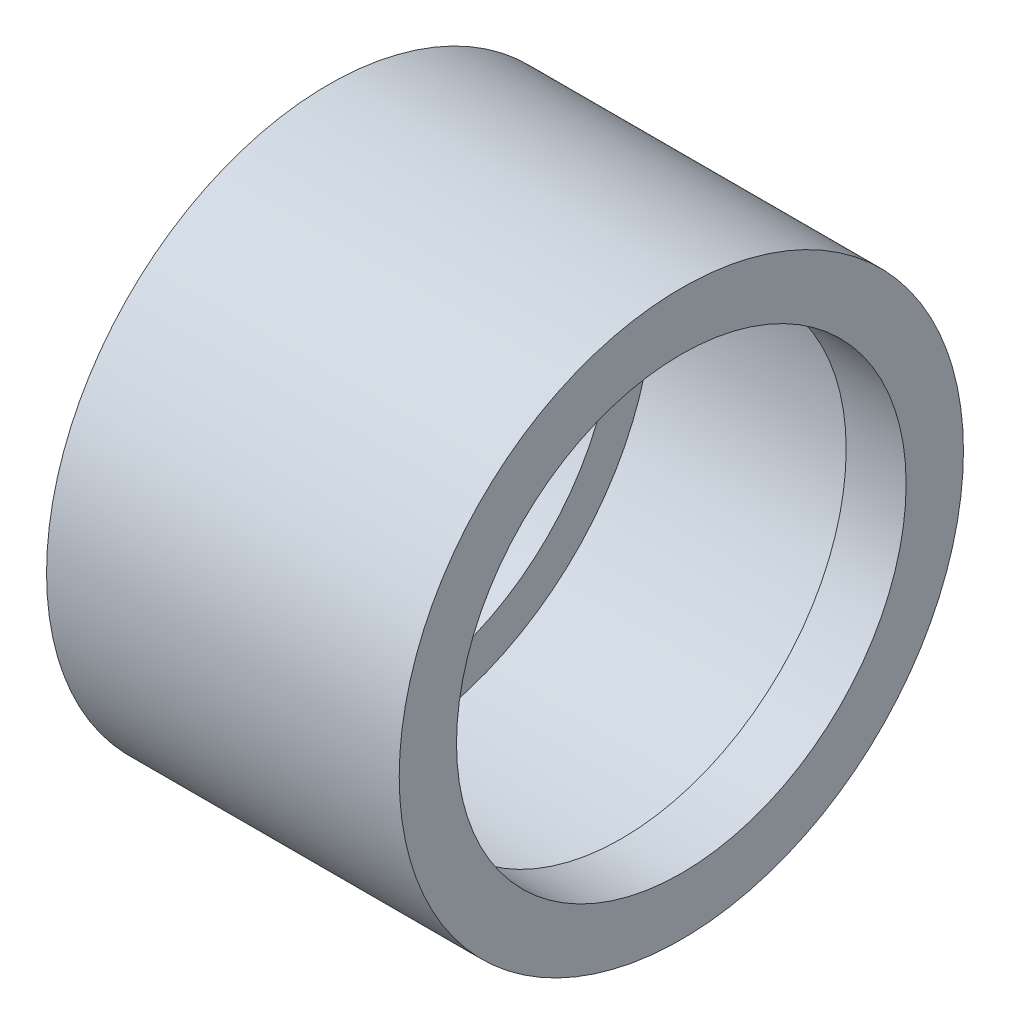
ISO-10303-21;
HEADER;
FILE_DESCRIPTION(('STEP AP214'),'2;1');
FILE_NAME('part.step','',(''),(''),'','','');
FILE_SCHEMA(('AUTOMOTIVE_DESIGN { 1 0 10303 214 1 1 1 1 }'));
ENDSEC;
DATA;
#1=APPLICATION_CONTEXT('core data for automotive mechanical design processes');
#2=APPLICATION_PROTOCOL_DEFINITION('international standard','automotive_design',2000,#1);
#3=PRODUCT_CONTEXT('',#1,'mechanical');
#4=PRODUCT('Part','Part','',(#3));
#5=PRODUCT_RELATED_PRODUCT_CATEGORY('part','',(#4));
#6=PRODUCT_DEFINITION_FORMATION('','',#4);
#7=PRODUCT_DEFINITION_CONTEXT('part definition',#1,'design');
#8=PRODUCT_DEFINITION('design','',#6,#7);
#9=PRODUCT_DEFINITION_SHAPE('','',#8);
#10=(LENGTH_UNIT() NAMED_UNIT(*) SI_UNIT(.MILLI.,.METRE.));
#11=(NAMED_UNIT(*) PLANE_ANGLE_UNIT() SI_UNIT($,.RADIAN.));
#12=(NAMED_UNIT(*) SI_UNIT($,.STERADIAN.) SOLID_ANGLE_UNIT());
#13=UNCERTAINTY_MEASURE_WITH_UNIT(LENGTH_MEASURE(1.E-05),#10,'distance_accuracy_value','');
#14=(GEOMETRIC_REPRESENTATION_CONTEXT(3) GLOBAL_UNCERTAINTY_ASSIGNED_CONTEXT((#13)) GLOBAL_UNIT_ASSIGNED_CONTEXT((#10,
#11,#12)) REPRESENTATION_CONTEXT('',''));
#15=CARTESIAN_POINT('',(0.,0.,0.));
#16=DIRECTION('',(0.,0.,1.));
#17=DIRECTION('',(1.,0.,0.));
#18=AXIS2_PLACEMENT_3D('',#15,#16,#17);
#19=CARTESIAN_POINT('',(0.,-8.21859166127047,-8.));
#20=DIRECTION('',(-1.,0.,0.));
#21=DIRECTION('',(0.,0.,1.));
#22=AXIS2_PLACEMENT_3D('',#19,#20,#21);
#23=PLANE('',#22);
#24=CARTESIAN_POINT('',(0.,0.,0.));
#25=DIRECTION('',(-1.,0.,0.));
#26=DIRECTION('',(0.,0.,-1.));
#27=AXIS2_PLACEMENT_3D('',#24,#25,#26);
#28=CIRCLE('',#27,8.);
#29=CARTESIAN_POINT('',(0.,0.,-8.));
#30=VERTEX_POINT('',#29);
#31=EDGE_CURVE('E44',#30,#30,#28,.F.);
#32=ORIENTED_EDGE('',*,*,#31,.F.);
#33=EDGE_LOOP('',(#32));
#34=FACE_BOUND('',#33,.T.);
#35=CARTESIAN_POINT('',(0.,0.,0.));
#36=DIRECTION('',(1.,0.,0.));
#37=DIRECTION('',(0.,0.,1.));
#38=AXIS2_PLACEMENT_3D('',#35,#36,#37);
#39=CIRCLE('',#38,6.375);
#40=CARTESIAN_POINT('',(0.,0.,6.375));
#41=VERTEX_POINT('',#40);
#42=EDGE_CURVE('E41',#41,#41,#39,.T.);
#43=ORIENTED_EDGE('',*,*,#42,.T.);
#44=EDGE_LOOP('',(#43));
#45=FACE_BOUND('',#44,.T.);
#46=ADVANCED_FACE('F15',(#34,#45),#23,.T.);
#47=CARTESIAN_POINT('',(1.7,-7.70492968244106,7.5));
#48=DIRECTION('',(1.,0.,0.));
#49=DIRECTION('',(0.,0.,-1.));
#50=AXIS2_PLACEMENT_3D('',#47,#48,#49);
#51=PLANE('',#50);
#52=CARTESIAN_POINT('',(1.7,0.,0.));
#53=DIRECTION('',(1.,0.,0.));
#54=DIRECTION('',(0.,0.,1.));
#55=AXIS2_PLACEMENT_3D('',#52,#53,#54);
#56=CIRCLE('',#55,7.5);
#57=CARTESIAN_POINT('',(1.7,0.,7.5));
#58=VERTEX_POINT('',#57);
#59=EDGE_CURVE('E38',#58,#58,#56,.T.);
#60=ORIENTED_EDGE('',*,*,#59,.T.);
#61=EDGE_LOOP('',(#60));
#62=FACE_BOUND('',#61,.T.);
#63=CARTESIAN_POINT('',(1.7,0.,0.));
#64=DIRECTION('',(-1.,0.,0.));
#65=DIRECTION('',(0.,0.,-1.));
#66=AXIS2_PLACEMENT_3D('',#63,#64,#65);
#67=CIRCLE('',#66,6.375);
#68=CARTESIAN_POINT('',(1.7,0.,-6.375));
#69=VERTEX_POINT('',#68);
#70=EDGE_CURVE('E35',#69,#69,#67,.F.);
#71=ORIENTED_EDGE('',*,*,#70,.F.);
#72=EDGE_LOOP('',(#71));
#73=FACE_BOUND('',#72,.T.);
#74=ADVANCED_FACE('F52',(#62,#73),#51,.T.);
#75=CARTESIAN_POINT('',(8.3,-7.70492968244106,-7.5));
#76=DIRECTION('',(-1.,0.,0.));
#77=DIRECTION('',(0.,0.,1.));
#78=AXIS2_PLACEMENT_3D('',#75,#76,#77);
#79=PLANE('',#78);
#80=CARTESIAN_POINT('',(8.3,0.,0.));
#81=DIRECTION('',(-1.,0.,0.));
#82=DIRECTION('',(0.,0.,-1.));
#83=AXIS2_PLACEMENT_3D('',#80,#81,#82);
#84=CIRCLE('',#83,7.5);
#85=CARTESIAN_POINT('',(8.3,0.,-7.5));
#86=VERTEX_POINT('',#85);
#87=EDGE_CURVE('E30',#86,#86,#84,.F.);
#88=ORIENTED_EDGE('',*,*,#87,.F.);
#89=EDGE_LOOP('',(#88));
#90=FACE_BOUND('',#89,.T.);
#91=CARTESIAN_POINT('',(8.3,0.,0.));
#92=DIRECTION('',(1.,0.,0.));
#93=DIRECTION('',(0.,0.,1.));
#94=AXIS2_PLACEMENT_3D('',#91,#92,#93);
#95=CIRCLE('',#94,6.375);
#96=CARTESIAN_POINT('',(8.3,0.,6.375));
#97=VERTEX_POINT('',#96);
#98=EDGE_CURVE('E26',#97,#97,#95,.T.);
#99=ORIENTED_EDGE('',*,*,#98,.T.);
#100=EDGE_LOOP('',(#99));
#101=FACE_BOUND('',#100,.T.);
#102=ADVANCED_FACE('F70',(#90,#101),#79,.T.);
#103=CARTESIAN_POINT('',(10.,-8.21859166127047,8.));
#104=DIRECTION('',(1.,0.,0.));
#105=DIRECTION('',(0.,0.,-1.));
#106=AXIS2_PLACEMENT_3D('',#103,#104,#105);
#107=PLANE('',#106);
#108=CARTESIAN_POINT('',(10.,0.,0.));
#109=DIRECTION('',(1.,0.,0.));
#110=DIRECTION('',(0.,0.,1.));
#111=AXIS2_PLACEMENT_3D('',#108,#109,#110);
#112=CIRCLE('',#111,8.);
#113=CARTESIAN_POINT('',(10.,0.,8.));
#114=VERTEX_POINT('',#113);
#115=EDGE_CURVE('E22',#114,#114,#112,.T.);
#116=ORIENTED_EDGE('',*,*,#115,.T.);
#117=EDGE_LOOP('',(#116));
#118=FACE_BOUND('',#117,.T.);
#119=CARTESIAN_POINT('',(10.,0.,0.));
#120=DIRECTION('',(-1.,0.,0.));
#121=DIRECTION('',(0.,0.,-1.));
#122=AXIS2_PLACEMENT_3D('',#119,#120,#121);
#123=CIRCLE('',#122,6.375);
#124=CARTESIAN_POINT('',(10.,0.,-6.375));
#125=VERTEX_POINT('',#124);
#126=EDGE_CURVE('E10',#125,#125,#123,.F.);
#127=ORIENTED_EDGE('',*,*,#126,.F.);
#128=EDGE_LOOP('',(#127));
#129=FACE_BOUND('',#128,.T.);
#130=ADVANCED_FACE('F59',(#118,#129),#107,.T.);
#131=CARTESIAN_POINT('',(50.,0.,0.));
#132=DIRECTION('',(1.,0.,0.));
#133=DIRECTION('',(0.,0.,1.));
#134=AXIS2_PLACEMENT_3D('',#131,#132,#133);
#135=CYLINDRICAL_SURFACE('',#134,6.375);
#136=ORIENTED_EDGE('',*,*,#70,.T.);
#137=EDGE_LOOP('',(#136));
#138=FACE_BOUND('',#137,.T.);
#139=ORIENTED_EDGE('',*,*,#42,.F.);
#140=EDGE_LOOP('',(#139));
#141=FACE_BOUND('',#140,.T.);
#142=ADVANCED_FACE('F56',(#138,#141),#135,.F.);
#143=CARTESIAN_POINT('',(50.,0.,0.));
#144=DIRECTION('',(1.,0.,0.));
#145=DIRECTION('',(0.,0.,1.));
#146=AXIS2_PLACEMENT_3D('',#143,#144,#145);
#147=CYLINDRICAL_SURFACE('',#146,7.5);
#148=ORIENTED_EDGE('',*,*,#87,.T.);
#149=EDGE_LOOP('',(#148));
#150=FACE_BOUND('',#149,.T.);
#151=ORIENTED_EDGE('',*,*,#59,.F.);
#152=EDGE_LOOP('',(#151));
#153=FACE_BOUND('',#152,.T.);
#154=ADVANCED_FACE('F58',(#150,#153),#147,.F.);
#155=CARTESIAN_POINT('',(50.,0.,0.));
#156=DIRECTION('',(1.,0.,0.));
#157=DIRECTION('',(0.,0.,1.));
#158=AXIS2_PLACEMENT_3D('',#155,#156,#157);
#159=CYLINDRICAL_SURFACE('',#158,6.375);
#160=ORIENTED_EDGE('',*,*,#126,.T.);
#161=EDGE_LOOP('',(#160));
#162=FACE_BOUND('',#161,.T.);
#163=ORIENTED_EDGE('',*,*,#98,.F.);
#164=EDGE_LOOP('',(#163));
#165=FACE_BOUND('',#164,.T.);
#166=ADVANCED_FACE('F67',(#162,#165),#159,.F.);
#167=CARTESIAN_POINT('',(50.,0.,0.));
#168=DIRECTION('',(1.,0.,0.));
#169=DIRECTION('',(0.,0.,1.));
#170=AXIS2_PLACEMENT_3D('',#167,#168,#169);
#171=CYLINDRICAL_SURFACE('',#170,8.);
#172=ORIENTED_EDGE('',*,*,#31,.T.);
#173=EDGE_LOOP('',(#172));
#174=FACE_BOUND('',#173,.T.);
#175=ORIENTED_EDGE('',*,*,#115,.F.);
#176=EDGE_LOOP('',(#175));
#177=FACE_BOUND('',#176,.T.);
#178=ADVANCED_FACE('F17',(#174,#177),#171,.T.);
#179=CLOSED_SHELL('',(#46,#74,#102,#130,#142,#154,#166,#178));
#180=MANIFOLD_SOLID_BREP('B1',#179);
#181=ADVANCED_BREP_SHAPE_REPRESENTATION('',(#18,#180),#14);
#182=SHAPE_DEFINITION_REPRESENTATION(#9,#181);
ENDSEC;
END-ISO-10303-21;
